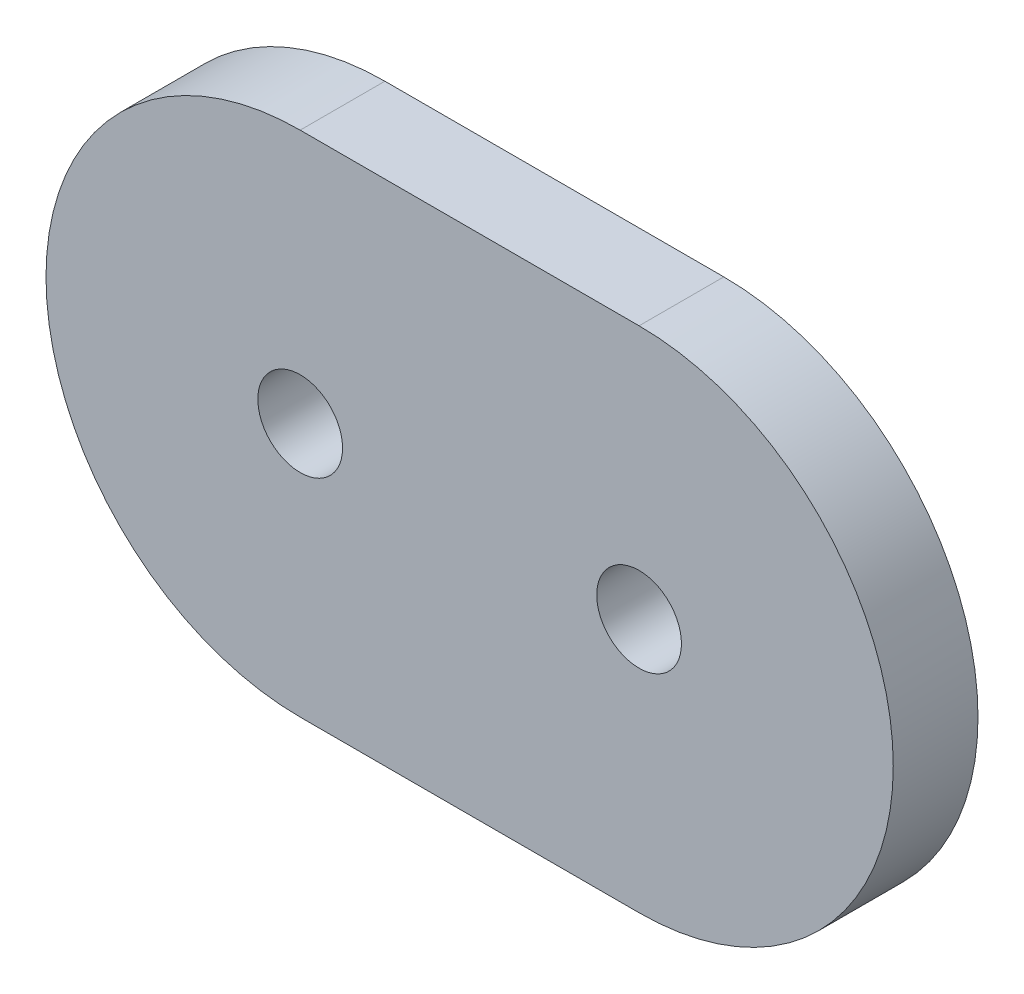
ISO-10303-21;
HEADER;
FILE_DESCRIPTION(('STEP AP214'),'2;1');
FILE_NAME('part.step','',(''),(''),'','','');
FILE_SCHEMA(('AUTOMOTIVE_DESIGN { 1 0 10303 214 1 1 1 1 }'));
ENDSEC;
DATA;
#1=APPLICATION_CONTEXT('core data for automotive mechanical design processes');
#2=APPLICATION_PROTOCOL_DEFINITION('international standard','automotive_design',2000,#1);
#3=PRODUCT_CONTEXT('',#1,'mechanical');
#4=PRODUCT('Part','Part','',(#3));
#5=PRODUCT_RELATED_PRODUCT_CATEGORY('part','',(#4));
#6=PRODUCT_DEFINITION_FORMATION('','',#4);
#7=PRODUCT_DEFINITION_CONTEXT('part definition',#1,'design');
#8=PRODUCT_DEFINITION('design','',#6,#7);
#9=PRODUCT_DEFINITION_SHAPE('','',#8);
#10=(LENGTH_UNIT() NAMED_UNIT(*) SI_UNIT(.MILLI.,.METRE.));
#11=(NAMED_UNIT(*) PLANE_ANGLE_UNIT() SI_UNIT($,.RADIAN.));
#12=(NAMED_UNIT(*) SI_UNIT($,.STERADIAN.) SOLID_ANGLE_UNIT());
#13=UNCERTAINTY_MEASURE_WITH_UNIT(LENGTH_MEASURE(1.E-05),#10,'distance_accuracy_value','');
#14=(GEOMETRIC_REPRESENTATION_CONTEXT(3) GLOBAL_UNCERTAINTY_ASSIGNED_CONTEXT((#13)) GLOBAL_UNIT_ASSIGNED_CONTEXT((#10,
#11,#12)) REPRESENTATION_CONTEXT('',''));
#15=CARTESIAN_POINT('',(0.,0.,0.));
#16=DIRECTION('',(0.,0.,1.));
#17=DIRECTION('',(1.,0.,0.));
#18=AXIS2_PLACEMENT_3D('',#15,#16,#17);
#19=CARTESIAN_POINT('',(-4.35483870967742,0.,0.5));
#20=DIRECTION('',(0.,0.,1.));
#21=DIRECTION('',(1.,0.,0.));
#22=AXIS2_PLACEMENT_3D('',#19,#20,#21);
#23=PLANE('',#22);
#24=CARTESIAN_POINT('',(-4.35483870967742,0.,0.5));
#25=DIRECTION('',(0.,0.,1.));
#26=DIRECTION('',(1.,0.,0.));
#27=AXIS2_PLACEMENT_3D('',#24,#25,#26);
#28=CIRCLE('',#27,0.25);
#29=CARTESIAN_POINT('',(-4.10483870967742,0.,0.5));
#30=VERTEX_POINT('',#29);
#31=EDGE_CURVE('E104',#30,#30,#28,.T.);
#32=ORIENTED_EDGE('',*,*,#31,.F.);
#33=EDGE_LOOP('',(#32));
#34=FACE_BOUND('',#33,.T.);
#35=CARTESIAN_POINT('',(-4.35483870967742,0.,0.5));
#36=DIRECTION('',(0.,0.,1.));
#37=DIRECTION('',(1.,0.,0.));
#38=AXIS2_PLACEMENT_3D('',#35,#36,#37);
#39=CIRCLE('',#38,1.5);
#40=CARTESIAN_POINT('',(-4.35483870967742,1.5,0.5));
#41=VERTEX_POINT('',#40);
#42=CARTESIAN_POINT('',(-4.35483870967742,-1.5,0.5));
#43=VERTEX_POINT('',#42);
#44=EDGE_CURVE('E89',#41,#43,#39,.T.);
#45=ORIENTED_EDGE('',*,*,#44,.T.);
#46=DIRECTION('',(1.,0.,0.));
#47=VECTOR('',#46,1.);
#48=CARTESIAN_POINT('',(-4.35483870967742,-1.5,0.5));
#49=LINE('',#48,#47);
#50=CARTESIAN_POINT('',(-2.35483870967742,-1.5,0.5));
#51=VERTEX_POINT('',#50);
#52=EDGE_CURVE('E84',#43,#51,#49,.T.);
#53=ORIENTED_EDGE('',*,*,#52,.T.);
#54=CARTESIAN_POINT('',(-2.35483870967742,0.,0.5));
#55=DIRECTION('',(0.,0.,1.));
#56=DIRECTION('',(-1.,0.,0.));
#57=AXIS2_PLACEMENT_3D('',#54,#55,#56);
#58=CIRCLE('',#57,1.5);
#59=CARTESIAN_POINT('',(-2.35483870967742,1.5,0.5));
#60=VERTEX_POINT('',#59);
#61=EDGE_CURVE('E87',#51,#60,#58,.T.);
#62=ORIENTED_EDGE('',*,*,#61,.T.);
#63=DIRECTION('',(-1.,0.,0.));
#64=VECTOR('',#63,1.);
#65=CARTESIAN_POINT('',(-4.35483870967742,1.5,0.5));
#66=LINE('',#65,#64);
#67=EDGE_CURVE('E54',#60,#41,#66,.T.);
#68=ORIENTED_EDGE('',*,*,#67,.T.);
#69=EDGE_LOOP('',(#45,#53,#62,#68));
#70=FACE_BOUND('',#69,.T.);
#71=CARTESIAN_POINT('',(-2.35483870967742,0.,0.5));
#72=DIRECTION('',(0.,0.,1.));
#73=DIRECTION('',(1.,0.,0.));
#74=AXIS2_PLACEMENT_3D('',#71,#72,#73);
#75=CIRCLE('',#74,0.25);
#76=CARTESIAN_POINT('',(-2.10483870967742,0.,0.5));
#77=VERTEX_POINT('',#76);
#78=EDGE_CURVE('E119',#77,#77,#75,.T.);
#79=ORIENTED_EDGE('',*,*,#78,.F.);
#80=EDGE_LOOP('',(#79));
#81=FACE_BOUND('',#80,.T.);
#82=ADVANCED_FACE('F37',(#34,#70,#81),#23,.T.);
#83=CARTESIAN_POINT('',(-4.35483870967742,0.,0.));
#84=DIRECTION('',(0.,0.,1.));
#85=DIRECTION('',(1.,0.,0.));
#86=AXIS2_PLACEMENT_3D('',#83,#84,#85);
#87=PLANE('',#86);
#88=CARTESIAN_POINT('',(-4.35483870967742,0.,0.));
#89=DIRECTION('',(0.,0.,1.));
#90=DIRECTION('',(1.,0.,0.));
#91=AXIS2_PLACEMENT_3D('',#88,#89,#90);
#92=CIRCLE('',#91,1.5);
#93=CARTESIAN_POINT('',(-4.35483870967742,1.5,0.));
#94=VERTEX_POINT('',#93);
#95=CARTESIAN_POINT('',(-4.35483870967742,-1.5,0.));
#96=VERTEX_POINT('',#95);
#97=EDGE_CURVE('E101',#94,#96,#92,.T.);
#98=ORIENTED_EDGE('',*,*,#97,.F.);
#99=DIRECTION('',(-1.,0.,0.));
#100=VECTOR('',#99,1.);
#101=CARTESIAN_POINT('',(-4.35483870967742,1.5,0.));
#102=LINE('',#101,#100);
#103=CARTESIAN_POINT('',(-2.35483870967742,1.5,0.));
#104=VERTEX_POINT('',#103);
#105=EDGE_CURVE('E77',#104,#94,#102,.T.);
#106=ORIENTED_EDGE('',*,*,#105,.F.);
#107=CARTESIAN_POINT('',(-2.35483870967742,0.,0.));
#108=DIRECTION('',(0.,0.,1.));
#109=DIRECTION('',(-1.,0.,0.));
#110=AXIS2_PLACEMENT_3D('',#107,#108,#109);
#111=CIRCLE('',#110,1.5);
#112=CARTESIAN_POINT('',(-2.35483870967742,-1.5,0.));
#113=VERTEX_POINT('',#112);
#114=EDGE_CURVE('E71',#113,#104,#111,.T.);
#115=ORIENTED_EDGE('',*,*,#114,.F.);
#116=DIRECTION('',(1.,0.,0.));
#117=VECTOR('',#116,1.);
#118=CARTESIAN_POINT('',(-4.35483870967742,-1.5,0.));
#119=LINE('',#118,#117);
#120=EDGE_CURVE('E93',#96,#113,#119,.T.);
#121=ORIENTED_EDGE('',*,*,#120,.F.);
#122=EDGE_LOOP('',(#98,#106,#115,#121));
#123=FACE_BOUND('',#122,.T.);
#124=CARTESIAN_POINT('',(-4.35483870967742,0.,0.));
#125=DIRECTION('',(0.,0.,1.));
#126=DIRECTION('',(1.,0.,0.));
#127=AXIS2_PLACEMENT_3D('',#124,#125,#126);
#128=CIRCLE('',#127,0.25);
#129=CARTESIAN_POINT('',(-4.10483870967742,0.,0.));
#130=VERTEX_POINT('',#129);
#131=EDGE_CURVE('E116',#130,#130,#128,.T.);
#132=ORIENTED_EDGE('',*,*,#131,.T.);
#133=EDGE_LOOP('',(#132));
#134=FACE_BOUND('',#133,.T.);
#135=CARTESIAN_POINT('',(-2.35483870967742,0.,0.));
#136=DIRECTION('',(0.,0.,1.));
#137=DIRECTION('',(1.,0.,0.));
#138=AXIS2_PLACEMENT_3D('',#135,#136,#137);
#139=CIRCLE('',#138,0.25);
#140=CARTESIAN_POINT('',(-2.10483870967742,0.,0.));
#141=VERTEX_POINT('',#140);
#142=EDGE_CURVE('E122',#141,#141,#139,.T.);
#143=ORIENTED_EDGE('',*,*,#142,.T.);
#144=EDGE_LOOP('',(#143));
#145=FACE_BOUND('',#144,.T.);
#146=ADVANCED_FACE('F112',(#123,#134,#145),#87,.F.);
#147=CARTESIAN_POINT('',(-4.35483870967742,0.,0.5));
#148=DIRECTION('',(0.,0.,-1.));
#149=DIRECTION('',(-1.,0.,0.));
#150=AXIS2_PLACEMENT_3D('',#147,#148,#149);
#151=CYLINDRICAL_SURFACE('',#150,1.5);
#152=ORIENTED_EDGE('',*,*,#97,.T.);
#153=DIRECTION('',(0.,0.,-1.));
#154=VECTOR('',#153,1.);
#155=CARTESIAN_POINT('',(-4.35483870967742,-1.5,0.5));
#156=LINE('',#155,#154);
#157=EDGE_CURVE('E11',#43,#96,#156,.T.);
#158=ORIENTED_EDGE('',*,*,#157,.F.);
#159=ORIENTED_EDGE('',*,*,#44,.F.);
#160=DIRECTION('',(0.,0.,-1.));
#161=VECTOR('',#160,1.);
#162=CARTESIAN_POINT('',(-4.35483870967742,1.5,0.5));
#163=LINE('',#162,#161);
#164=EDGE_CURVE('E97',#41,#94,#163,.T.);
#165=ORIENTED_EDGE('',*,*,#164,.T.);
#166=EDGE_LOOP('',(#152,#158,#159,#165));
#167=FACE_BOUND('',#166,.T.);
#168=ADVANCED_FACE('F39',(#167),#151,.T.);
#169=CARTESIAN_POINT('',(-4.35483870967742,-1.5,0.5));
#170=DIRECTION('',(0.,1.,0.));
#171=DIRECTION('',(-1.,0.,0.));
#172=AXIS2_PLACEMENT_3D('',#169,#170,#171);
#173=PLANE('',#172);
#174=ORIENTED_EDGE('',*,*,#120,.T.);
#175=DIRECTION('',(0.,0.,-1.));
#176=VECTOR('',#175,1.);
#177=CARTESIAN_POINT('',(-2.35483870967742,-1.5,0.5));
#178=LINE('',#177,#176);
#179=EDGE_CURVE('E46',#51,#113,#178,.T.);
#180=ORIENTED_EDGE('',*,*,#179,.F.);
#181=ORIENTED_EDGE('',*,*,#52,.F.);
#182=ORIENTED_EDGE('',*,*,#157,.T.);
#183=EDGE_LOOP('',(#174,#180,#181,#182));
#184=FACE_BOUND('',#183,.T.);
#185=ADVANCED_FACE('F92',(#184),#173,.F.);
#186=CARTESIAN_POINT('',(-2.35483870967742,0.,0.5));
#187=DIRECTION('',(0.,0.,-1.));
#188=DIRECTION('',(-1.,0.,0.));
#189=AXIS2_PLACEMENT_3D('',#186,#187,#188);
#190=CYLINDRICAL_SURFACE('',#189,1.5);
#191=ORIENTED_EDGE('',*,*,#114,.T.);
#192=DIRECTION('',(0.,0.,-1.));
#193=VECTOR('',#192,1.);
#194=CARTESIAN_POINT('',(-2.35483870967742,1.5,0.5));
#195=LINE('',#194,#193);
#196=EDGE_CURVE('E94',#60,#104,#195,.T.);
#197=ORIENTED_EDGE('',*,*,#196,.F.);
#198=ORIENTED_EDGE('',*,*,#61,.F.);
#199=ORIENTED_EDGE('',*,*,#179,.T.);
#200=EDGE_LOOP('',(#191,#197,#198,#199));
#201=FACE_BOUND('',#200,.T.);
#202=ADVANCED_FACE('F95',(#201),#190,.T.);
#203=CARTESIAN_POINT('',(-4.35483870967742,1.5,0.5));
#204=DIRECTION('',(0.,-1.,0.));
#205=DIRECTION('',(1.,0.,0.));
#206=AXIS2_PLACEMENT_3D('',#203,#204,#205);
#207=PLANE('',#206);
#208=ORIENTED_EDGE('',*,*,#105,.T.);
#209=ORIENTED_EDGE('',*,*,#164,.F.);
#210=ORIENTED_EDGE('',*,*,#67,.F.);
#211=ORIENTED_EDGE('',*,*,#196,.T.);
#212=EDGE_LOOP('',(#208,#209,#210,#211));
#213=FACE_BOUND('',#212,.T.);
#214=ADVANCED_FACE('F109',(#213),#207,.F.);
#215=CARTESIAN_POINT('',(-4.35483870967742,0.,0.5));
#216=DIRECTION('',(0.,0.,-1.));
#217=DIRECTION('',(-1.,0.,0.));
#218=AXIS2_PLACEMENT_3D('',#215,#216,#217);
#219=CYLINDRICAL_SURFACE('',#218,0.25);
#220=ORIENTED_EDGE('',*,*,#31,.T.);
#221=EDGE_LOOP('',(#220));
#222=FACE_BOUND('',#221,.T.);
#223=ORIENTED_EDGE('',*,*,#131,.F.);
#224=EDGE_LOOP('',(#223));
#225=FACE_BOUND('',#224,.T.);
#226=ADVANCED_FACE('F139',(#222,#225),#219,.F.);
#227=CARTESIAN_POINT('',(-2.35483870967742,0.,0.5));
#228=DIRECTION('',(0.,0.,-1.));
#229=DIRECTION('',(-1.,0.,0.));
#230=AXIS2_PLACEMENT_3D('',#227,#228,#229);
#231=CYLINDRICAL_SURFACE('',#230,0.25);
#232=ORIENTED_EDGE('',*,*,#78,.T.);
#233=EDGE_LOOP('',(#232));
#234=FACE_BOUND('',#233,.T.);
#235=ORIENTED_EDGE('',*,*,#142,.F.);
#236=EDGE_LOOP('',(#235));
#237=FACE_BOUND('',#236,.T.);
#238=ADVANCED_FACE('F128',(#234,#237),#231,.F.);
#239=CLOSED_SHELL('',(#82,#146,#168,#185,#202,#214,#226,#238));
#240=MANIFOLD_SOLID_BREP('B2',#239);
#241=ADVANCED_BREP_SHAPE_REPRESENTATION('',(#18,#240),#14);
#242=SHAPE_DEFINITION_REPRESENTATION(#9,#241);
ENDSEC;
END-ISO-10303-21;
